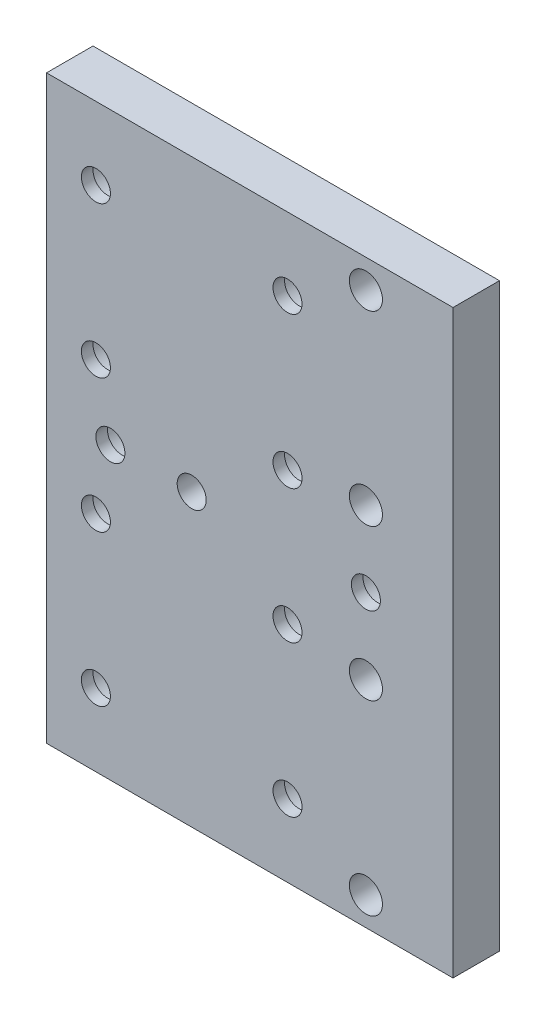
ISO-10303-21;
HEADER;
FILE_DESCRIPTION(('STEP AP214'),'2;1');
FILE_NAME('part.step','',(''),(''),'','','');
FILE_SCHEMA(('AUTOMOTIVE_DESIGN { 1 0 10303 214 1 1 1 1 }'));
ENDSEC;
DATA;
#1=APPLICATION_CONTEXT('core data for automotive mechanical design processes');
#2=APPLICATION_PROTOCOL_DEFINITION('international standard','automotive_design',2000,#1);
#3=PRODUCT_CONTEXT('',#1,'mechanical');
#4=PRODUCT('Part','Part','',(#3));
#5=PRODUCT_RELATED_PRODUCT_CATEGORY('part','',(#4));
#6=PRODUCT_DEFINITION_FORMATION('','',#4);
#7=PRODUCT_DEFINITION_CONTEXT('part definition',#1,'design');
#8=PRODUCT_DEFINITION('design','',#6,#7);
#9=PRODUCT_DEFINITION_SHAPE('','',#8);
#10=(LENGTH_UNIT() NAMED_UNIT(*) SI_UNIT(.MILLI.,.METRE.));
#11=(NAMED_UNIT(*) PLANE_ANGLE_UNIT() SI_UNIT($,.RADIAN.));
#12=(NAMED_UNIT(*) SI_UNIT($,.STERADIAN.) SOLID_ANGLE_UNIT());
#13=UNCERTAINTY_MEASURE_WITH_UNIT(LENGTH_MEASURE(1.E-05),#10,'distance_accuracy_value','');
#14=(GEOMETRIC_REPRESENTATION_CONTEXT(3) GLOBAL_UNCERTAINTY_ASSIGNED_CONTEXT((#13)) GLOBAL_UNIT_ASSIGNED_CONTEXT((#10,
#11,#12)) REPRESENTATION_CONTEXT('',''));
#15=CARTESIAN_POINT('',(0.,0.,0.));
#16=DIRECTION('',(0.,0.,1.));
#17=DIRECTION('',(1.,0.,0.));
#18=AXIS2_PLACEMENT_3D('',#15,#16,#17);
#19=CARTESIAN_POINT('',(-15.,0.,8.));
#20=DIRECTION('',(0.,0.,-1.));
#21=DIRECTION('',(-1.,0.,0.));
#22=AXIS2_PLACEMENT_3D('',#19,#20,#21);
#23=CYLINDRICAL_SURFACE('',#22,2.5);
#24=CARTESIAN_POINT('',(-15.,0.,8.));
#25=DIRECTION('',(0.,0.,-1.));
#26=DIRECTION('',(-1.,0.,0.));
#27=AXIS2_PLACEMENT_3D('',#24,#25,#26);
#28=CIRCLE('',#27,2.5);
#29=CARTESIAN_POINT('',(-17.5,0.,8.));
#30=VERTEX_POINT('',#29);
#31=EDGE_CURVE('E132',#30,#30,#28,.T.);
#32=ORIENTED_EDGE('',*,*,#31,.F.);
#33=EDGE_LOOP('',(#32));
#34=FACE_BOUND('',#33,.T.);
#35=CARTESIAN_POINT('',(-15.,0.,6.));
#36=DIRECTION('',(0.,0.,-1.));
#37=DIRECTION('',(-1.,0.,0.));
#38=AXIS2_PLACEMENT_3D('',#35,#36,#37);
#39=CIRCLE('',#38,2.5);
#40=CARTESIAN_POINT('',(-17.5,0.,6.));
#41=VERTEX_POINT('',#40);
#42=EDGE_CURVE('E38',#41,#41,#39,.F.);
#43=ORIENTED_EDGE('',*,*,#42,.F.);
#44=EDGE_LOOP('',(#43));
#45=FACE_BOUND('',#44,.T.);
#46=ADVANCED_FACE('F34',(#34,#45),#23,.F.);
#47=CARTESIAN_POINT('',(-59.,0.,8.));
#48=DIRECTION('',(0.,0.,-1.));
#49=DIRECTION('',(-1.,0.,0.));
#50=AXIS2_PLACEMENT_3D('',#47,#48,#49);
#51=CYLINDRICAL_SURFACE('',#50,2.5);
#52=CARTESIAN_POINT('',(-59.,0.,8.));
#53=DIRECTION('',(0.,0.,-1.));
#54=DIRECTION('',(-1.,0.,0.));
#55=AXIS2_PLACEMENT_3D('',#52,#53,#54);
#56=CIRCLE('',#55,2.5);
#57=CARTESIAN_POINT('',(-61.5,0.,8.));
#58=VERTEX_POINT('',#57);
#59=EDGE_CURVE('E93',#58,#58,#56,.T.);
#60=ORIENTED_EDGE('',*,*,#59,.F.);
#61=EDGE_LOOP('',(#60));
#62=FACE_BOUND('',#61,.T.);
#63=CARTESIAN_POINT('',(-59.,0.,6.));
#64=DIRECTION('',(0.,0.,-1.));
#65=DIRECTION('',(-1.,0.,0.));
#66=AXIS2_PLACEMENT_3D('',#63,#64,#65);
#67=CIRCLE('',#66,2.5);
#68=CARTESIAN_POINT('',(-61.5,0.,6.));
#69=VERTEX_POINT('',#68);
#70=EDGE_CURVE('E133',#69,#69,#67,.F.);
#71=ORIENTED_EDGE('',*,*,#70,.F.);
#72=EDGE_LOOP('',(#71));
#73=FACE_BOUND('',#72,.T.);
#74=ADVANCED_FACE('F281',(#62,#73),#51,.F.);
#75=CARTESIAN_POINT('',(-61.5,37.5,8.));
#76=DIRECTION('',(0.,0.,-1.));
#77=DIRECTION('',(-1.,0.,0.));
#78=AXIS2_PLACEMENT_3D('',#75,#76,#77);
#79=CYLINDRICAL_SURFACE('',#78,2.5);
#80=CARTESIAN_POINT('',(-61.5,37.5,8.));
#81=DIRECTION('',(0.,0.,1.));
#82=DIRECTION('',(1.,0.,0.));
#83=AXIS2_PLACEMENT_3D('',#80,#81,#82);
#84=CIRCLE('',#83,2.5);
#85=CARTESIAN_POINT('',(-59.,37.5,8.));
#86=VERTEX_POINT('',#85);
#87=EDGE_CURVE('E96',#86,#86,#84,.T.);
#88=ORIENTED_EDGE('',*,*,#87,.T.);
#89=EDGE_LOOP('',(#88));
#90=FACE_BOUND('',#89,.T.);
#91=CARTESIAN_POINT('',(-61.5,37.5,6.));
#92=DIRECTION('',(0.,0.,-1.));
#93=DIRECTION('',(-1.,0.,0.));
#94=AXIS2_PLACEMENT_3D('',#91,#92,#93);
#95=CIRCLE('',#94,2.5);
#96=CARTESIAN_POINT('',(-64.,37.5,6.));
#97=VERTEX_POINT('',#96);
#98=EDGE_CURVE('E130',#97,#97,#95,.T.);
#99=ORIENTED_EDGE('',*,*,#98,.T.);
#100=EDGE_LOOP('',(#99));
#101=FACE_BOUND('',#100,.T.);
#102=ADVANCED_FACE('F287',(#90,#101),#79,.F.);
#103=CARTESIAN_POINT('',(-28.5,37.5,8.));
#104=DIRECTION('',(0.,0.,-1.));
#105=DIRECTION('',(-1.,0.,0.));
#106=AXIS2_PLACEMENT_3D('',#103,#104,#105);
#107=CYLINDRICAL_SURFACE('',#106,2.5);
#108=CARTESIAN_POINT('',(-28.5,37.5,8.));
#109=DIRECTION('',(0.,0.,1.));
#110=DIRECTION('',(1.,0.,0.));
#111=AXIS2_PLACEMENT_3D('',#108,#109,#110);
#112=CIRCLE('',#111,2.5);
#113=CARTESIAN_POINT('',(-26.,37.5,8.));
#114=VERTEX_POINT('',#113);
#115=EDGE_CURVE('E101',#114,#114,#112,.T.);
#116=ORIENTED_EDGE('',*,*,#115,.T.);
#117=EDGE_LOOP('',(#116));
#118=FACE_BOUND('',#117,.T.);
#119=CARTESIAN_POINT('',(-28.5,37.5,6.));
#120=DIRECTION('',(0.,0.,-1.));
#121=DIRECTION('',(-1.,0.,0.));
#122=AXIS2_PLACEMENT_3D('',#119,#120,#121);
#123=CIRCLE('',#122,2.5);
#124=CARTESIAN_POINT('',(-31.,37.5,6.));
#125=VERTEX_POINT('',#124);
#126=EDGE_CURVE('E127',#125,#125,#123,.T.);
#127=ORIENTED_EDGE('',*,*,#126,.T.);
#128=EDGE_LOOP('',(#127));
#129=FACE_BOUND('',#128,.T.);
#130=ADVANCED_FACE('F487',(#118,#129),#107,.F.);
#131=CARTESIAN_POINT('',(-61.5,11.5,8.));
#132=DIRECTION('',(0.,0.,-1.));
#133=DIRECTION('',(-1.,0.,0.));
#134=AXIS2_PLACEMENT_3D('',#131,#132,#133);
#135=CYLINDRICAL_SURFACE('',#134,2.5);
#136=CARTESIAN_POINT('',(-61.5,11.5,8.));
#137=DIRECTION('',(0.,0.,1.));
#138=DIRECTION('',(1.,0.,0.));
#139=AXIS2_PLACEMENT_3D('',#136,#137,#138);
#140=CIRCLE('',#139,2.5);
#141=CARTESIAN_POINT('',(-59.,11.5,8.));
#142=VERTEX_POINT('',#141);
#143=EDGE_CURVE('E254',#142,#142,#140,.T.);
#144=ORIENTED_EDGE('',*,*,#143,.T.);
#145=EDGE_LOOP('',(#144));
#146=FACE_BOUND('',#145,.T.);
#147=CARTESIAN_POINT('',(-61.5,11.5,6.));
#148=DIRECTION('',(0.,0.,-1.));
#149=DIRECTION('',(-1.,0.,0.));
#150=AXIS2_PLACEMENT_3D('',#147,#148,#149);
#151=CIRCLE('',#150,2.5);
#152=CARTESIAN_POINT('',(-64.,11.5,6.));
#153=VERTEX_POINT('',#152);
#154=EDGE_CURVE('E124',#153,#153,#151,.T.);
#155=ORIENTED_EDGE('',*,*,#154,.T.);
#156=EDGE_LOOP('',(#155));
#157=FACE_BOUND('',#156,.T.);
#158=ADVANCED_FACE('F498',(#146,#157),#135,.F.);
#159=CARTESIAN_POINT('',(-28.5,11.5,8.));
#160=DIRECTION('',(0.,0.,-1.));
#161=DIRECTION('',(-1.,0.,0.));
#162=AXIS2_PLACEMENT_3D('',#159,#160,#161);
#163=CYLINDRICAL_SURFACE('',#162,2.5);
#164=CARTESIAN_POINT('',(-28.5,11.5,8.));
#165=DIRECTION('',(0.,0.,1.));
#166=DIRECTION('',(1.,0.,0.));
#167=AXIS2_PLACEMENT_3D('',#164,#165,#166);
#168=CIRCLE('',#167,2.5);
#169=CARTESIAN_POINT('',(-26.,11.5,8.));
#170=VERTEX_POINT('',#169);
#171=EDGE_CURVE('E251',#170,#170,#168,.T.);
#172=ORIENTED_EDGE('',*,*,#171,.T.);
#173=EDGE_LOOP('',(#172));
#174=FACE_BOUND('',#173,.T.);
#175=CARTESIAN_POINT('',(-28.5,11.5,6.));
#176=DIRECTION('',(0.,0.,-1.));
#177=DIRECTION('',(-1.,0.,0.));
#178=AXIS2_PLACEMENT_3D('',#175,#176,#177);
#179=CIRCLE('',#178,2.5);
#180=CARTESIAN_POINT('',(-31.,11.5,6.));
#181=VERTEX_POINT('',#180);
#182=EDGE_CURVE('E121',#181,#181,#179,.T.);
#183=ORIENTED_EDGE('',*,*,#182,.T.);
#184=EDGE_LOOP('',(#183));
#185=FACE_BOUND('',#184,.T.);
#186=ADVANCED_FACE('F508',(#174,#185),#163,.F.);
#187=CARTESIAN_POINT('',(-61.5,-11.5,8.));
#188=DIRECTION('',(0.,0.,-1.));
#189=DIRECTION('',(-1.,0.,0.));
#190=AXIS2_PLACEMENT_3D('',#187,#188,#189);
#191=CYLINDRICAL_SURFACE('',#190,2.5);
#192=CARTESIAN_POINT('',(-61.5,-11.5,8.));
#193=DIRECTION('',(0.,0.,1.));
#194=DIRECTION('',(1.,0.,0.));
#195=AXIS2_PLACEMENT_3D('',#192,#193,#194);
#196=CIRCLE('',#195,2.5);
#197=CARTESIAN_POINT('',(-59.,-11.5,8.));
#198=VERTEX_POINT('',#197);
#199=EDGE_CURVE('E248',#198,#198,#196,.T.);
#200=ORIENTED_EDGE('',*,*,#199,.T.);
#201=EDGE_LOOP('',(#200));
#202=FACE_BOUND('',#201,.T.);
#203=CARTESIAN_POINT('',(-61.5,-11.5,6.));
#204=DIRECTION('',(0.,0.,-1.));
#205=DIRECTION('',(-1.,0.,0.));
#206=AXIS2_PLACEMENT_3D('',#203,#204,#205);
#207=CIRCLE('',#206,2.5);
#208=CARTESIAN_POINT('',(-64.,-11.5,6.));
#209=VERTEX_POINT('',#208);
#210=EDGE_CURVE('E118',#209,#209,#207,.T.);
#211=ORIENTED_EDGE('',*,*,#210,.T.);
#212=EDGE_LOOP('',(#211));
#213=FACE_BOUND('',#212,.T.);
#214=ADVANCED_FACE('F518',(#202,#213),#191,.F.);
#215=CARTESIAN_POINT('',(-28.5,-11.5,8.));
#216=DIRECTION('',(0.,0.,-1.));
#217=DIRECTION('',(-1.,0.,0.));
#218=AXIS2_PLACEMENT_3D('',#215,#216,#217);
#219=CYLINDRICAL_SURFACE('',#218,2.5);
#220=CARTESIAN_POINT('',(-28.5,-11.5,8.));
#221=DIRECTION('',(0.,0.,1.));
#222=DIRECTION('',(1.,0.,0.));
#223=AXIS2_PLACEMENT_3D('',#220,#221,#222);
#224=CIRCLE('',#223,2.5);
#225=CARTESIAN_POINT('',(-26.,-11.5,8.));
#226=VERTEX_POINT('',#225);
#227=EDGE_CURVE('E245',#226,#226,#224,.T.);
#228=ORIENTED_EDGE('',*,*,#227,.T.);
#229=EDGE_LOOP('',(#228));
#230=FACE_BOUND('',#229,.T.);
#231=CARTESIAN_POINT('',(-28.5,-11.5,6.));
#232=DIRECTION('',(0.,0.,-1.));
#233=DIRECTION('',(-1.,0.,0.));
#234=AXIS2_PLACEMENT_3D('',#231,#232,#233);
#235=CIRCLE('',#234,2.5);
#236=CARTESIAN_POINT('',(-31.,-11.5,6.));
#237=VERTEX_POINT('',#236);
#238=EDGE_CURVE('E115',#237,#237,#235,.T.);
#239=ORIENTED_EDGE('',*,*,#238,.T.);
#240=EDGE_LOOP('',(#239));
#241=FACE_BOUND('',#240,.T.);
#242=ADVANCED_FACE('F528',(#230,#241),#219,.F.);
#243=CARTESIAN_POINT('',(-28.5,-37.5,8.));
#244=DIRECTION('',(0.,0.,-1.));
#245=DIRECTION('',(-1.,0.,0.));
#246=AXIS2_PLACEMENT_3D('',#243,#244,#245);
#247=CYLINDRICAL_SURFACE('',#246,2.5);
#248=CARTESIAN_POINT('',(-28.5,-37.5,8.));
#249=DIRECTION('',(0.,0.,1.));
#250=DIRECTION('',(1.,0.,0.));
#251=AXIS2_PLACEMENT_3D('',#248,#249,#250);
#252=CIRCLE('',#251,2.5);
#253=CARTESIAN_POINT('',(-26.,-37.5,8.));
#254=VERTEX_POINT('',#253);
#255=EDGE_CURVE('E242',#254,#254,#252,.T.);
#256=ORIENTED_EDGE('',*,*,#255,.T.);
#257=EDGE_LOOP('',(#256));
#258=FACE_BOUND('',#257,.T.);
#259=CARTESIAN_POINT('',(-28.5,-37.5,6.));
#260=DIRECTION('',(0.,0.,-1.));
#261=DIRECTION('',(-1.,0.,0.));
#262=AXIS2_PLACEMENT_3D('',#259,#260,#261);
#263=CIRCLE('',#262,2.5);
#264=CARTESIAN_POINT('',(-31.,-37.5,6.));
#265=VERTEX_POINT('',#264);
#266=EDGE_CURVE('E111',#265,#265,#263,.T.);
#267=ORIENTED_EDGE('',*,*,#266,.T.);
#268=EDGE_LOOP('',(#267));
#269=FACE_BOUND('',#268,.T.);
#270=ADVANCED_FACE('F538',(#258,#269),#247,.F.);
#271=CARTESIAN_POINT('',(-61.5,-37.5,8.));
#272=DIRECTION('',(0.,0.,-1.));
#273=DIRECTION('',(-1.,0.,0.));
#274=AXIS2_PLACEMENT_3D('',#271,#272,#273);
#275=CYLINDRICAL_SURFACE('',#274,2.5);
#276=CARTESIAN_POINT('',(-61.5,-37.5,8.));
#277=DIRECTION('',(0.,0.,1.));
#278=DIRECTION('',(1.,0.,0.));
#279=AXIS2_PLACEMENT_3D('',#276,#277,#278);
#280=CIRCLE('',#279,2.5);
#281=CARTESIAN_POINT('',(-59.,-37.5,8.));
#282=VERTEX_POINT('',#281);
#283=EDGE_CURVE('E237',#282,#282,#280,.T.);
#284=ORIENTED_EDGE('',*,*,#283,.T.);
#285=EDGE_LOOP('',(#284));
#286=FACE_BOUND('',#285,.T.);
#287=CARTESIAN_POINT('',(-61.5,-37.5,6.));
#288=DIRECTION('',(0.,0.,-1.));
#289=DIRECTION('',(-1.,0.,0.));
#290=AXIS2_PLACEMENT_3D('',#287,#288,#289);
#291=CIRCLE('',#290,2.5);
#292=CARTESIAN_POINT('',(-64.,-37.5,6.));
#293=VERTEX_POINT('',#292);
#294=EDGE_CURVE('E108',#293,#293,#291,.T.);
#295=ORIENTED_EDGE('',*,*,#294,.T.);
#296=EDGE_LOOP('',(#295));
#297=FACE_BOUND('',#296,.T.);
#298=ADVANCED_FACE('F548',(#286,#297),#275,.F.);
#299=CARTESIAN_POINT('',(0.,0.,8.));
#300=DIRECTION('',(0.,0.,1.));
#301=DIRECTION('',(1.,0.,0.));
#302=AXIS2_PLACEMENT_3D('',#299,#300,#301);
#303=PLANE('',#302);
#304=ORIENTED_EDGE('',*,*,#59,.T.);
#305=EDGE_LOOP('',(#304));
#306=FACE_BOUND('',#305,.T.);
#307=ORIENTED_EDGE('',*,*,#31,.T.);
#308=EDGE_LOOP('',(#307));
#309=FACE_BOUND('',#308,.T.);
#310=DIRECTION('',(-1.,0.,0.));
#311=VECTOR('',#310,1.);
#312=CARTESIAN_POINT('',(19.5289531826023,50.,8.));
#313=LINE('',#312,#311);
#314=CARTESIAN_POINT('',(0.,50.,8.));
#315=VERTEX_POINT('',#314);
#316=CARTESIAN_POINT('',(-70.,50.,8.));
#317=VERTEX_POINT('',#316);
#318=EDGE_CURVE('E51',#315,#317,#313,.T.);
#319=ORIENTED_EDGE('',*,*,#318,.T.);
#320=DIRECTION('',(0.,-1.,0.));
#321=VECTOR('',#320,1.);
#322=CARTESIAN_POINT('',(-70.,60.,8.));
#323=LINE('',#322,#321);
#324=CARTESIAN_POINT('',(-70.,-50.,8.));
#325=VERTEX_POINT('',#324);
#326=EDGE_CURVE('E98',#317,#325,#323,.T.);
#327=ORIENTED_EDGE('',*,*,#326,.T.);
#328=DIRECTION('',(1.,0.,0.));
#329=VECTOR('',#328,1.);
#330=CARTESIAN_POINT('',(25.5248272211387,-50.,8.));
#331=LINE('',#330,#329);
#332=CARTESIAN_POINT('',(0.,-50.,8.));
#333=VERTEX_POINT('',#332);
#334=EDGE_CURVE('E77',#325,#333,#331,.T.);
#335=ORIENTED_EDGE('',*,*,#334,.T.);
#336=DIRECTION('',(0.,1.,0.));
#337=VECTOR('',#336,1.);
#338=CARTESIAN_POINT('',(0.,-60.,8.));
#339=LINE('',#338,#337);
#340=EDGE_CURVE('E104',#333,#315,#339,.T.);
#341=ORIENTED_EDGE('',*,*,#340,.T.);
#342=EDGE_LOOP('',(#319,#327,#335,#341));
#343=FACE_BOUND('',#342,.T.);
#344=CARTESIAN_POINT('',(-45.,0.,8.));
#345=DIRECTION('',(0.,0.,1.));
#346=DIRECTION('',(1.,0.,0.));
#347=AXIS2_PLACEMENT_3D('',#344,#345,#346);
#348=CIRCLE('',#347,2.5);
#349=CARTESIAN_POINT('',(-42.5,0.,8.));
#350=VERTEX_POINT('',#349);
#351=EDGE_CURVE('E209',#350,#350,#348,.T.);
#352=ORIENTED_EDGE('',*,*,#351,.F.);
#353=EDGE_LOOP('',(#352));
#354=FACE_BOUND('',#353,.T.);
#355=CARTESIAN_POINT('',(-15.,-13.,8.));
#356=DIRECTION('',(0.,0.,1.));
#357=DIRECTION('',(1.,0.,0.));
#358=AXIS2_PLACEMENT_3D('',#355,#356,#357);
#359=CIRCLE('',#358,2.85);
#360=CARTESIAN_POINT('',(-12.15,-13.,8.));
#361=VERTEX_POINT('',#360);
#362=EDGE_CURVE('E222',#361,#361,#359,.T.);
#363=ORIENTED_EDGE('',*,*,#362,.F.);
#364=EDGE_LOOP('',(#363));
#365=FACE_BOUND('',#364,.T.);
#366=CARTESIAN_POINT('',(-15.,45.1,8.));
#367=DIRECTION('',(0.,0.,1.));
#368=DIRECTION('',(1.,0.,0.));
#369=AXIS2_PLACEMENT_3D('',#366,#367,#368);
#370=CIRCLE('',#369,2.85);
#371=CARTESIAN_POINT('',(-12.15,45.1,8.));
#372=VERTEX_POINT('',#371);
#373=EDGE_CURVE('E234',#372,#372,#370,.T.);
#374=ORIENTED_EDGE('',*,*,#373,.F.);
#375=EDGE_LOOP('',(#374));
#376=FACE_BOUND('',#375,.T.);
#377=ORIENTED_EDGE('',*,*,#255,.F.);
#378=EDGE_LOOP('',(#377));
#379=FACE_BOUND('',#378,.T.);
#380=ORIENTED_EDGE('',*,*,#199,.F.);
#381=EDGE_LOOP('',(#380));
#382=FACE_BOUND('',#381,.T.);
#383=ORIENTED_EDGE('',*,*,#143,.F.);
#384=EDGE_LOOP('',(#383));
#385=FACE_BOUND('',#384,.T.);
#386=ORIENTED_EDGE('',*,*,#87,.F.);
#387=EDGE_LOOP('',(#386));
#388=FACE_BOUND('',#387,.T.);
#389=ORIENTED_EDGE('',*,*,#115,.F.);
#390=EDGE_LOOP('',(#389));
#391=FACE_BOUND('',#390,.T.);
#392=ORIENTED_EDGE('',*,*,#171,.F.);
#393=EDGE_LOOP('',(#392));
#394=FACE_BOUND('',#393,.T.);
#395=ORIENTED_EDGE('',*,*,#227,.F.);
#396=EDGE_LOOP('',(#395));
#397=FACE_BOUND('',#396,.T.);
#398=ORIENTED_EDGE('',*,*,#283,.F.);
#399=EDGE_LOOP('',(#398));
#400=FACE_BOUND('',#399,.T.);
#401=CARTESIAN_POINT('',(-15.,13.,8.));
#402=DIRECTION('',(0.,0.,1.));
#403=DIRECTION('',(1.,0.,0.));
#404=AXIS2_PLACEMENT_3D('',#401,#402,#403);
#405=CIRCLE('',#404,2.85);
#406=CARTESIAN_POINT('',(-12.15,13.,8.));
#407=VERTEX_POINT('',#406);
#408=EDGE_CURVE('E228',#407,#407,#405,.T.);
#409=ORIENTED_EDGE('',*,*,#408,.F.);
#410=EDGE_LOOP('',(#409));
#411=FACE_BOUND('',#410,.T.);
#412=CARTESIAN_POINT('',(-15.,-45.1,8.));
#413=DIRECTION('',(0.,0.,1.));
#414=DIRECTION('',(1.,0.,0.));
#415=AXIS2_PLACEMENT_3D('',#412,#413,#414);
#416=CIRCLE('',#415,2.85);
#417=CARTESIAN_POINT('',(-12.15,-45.1,8.));
#418=VERTEX_POINT('',#417);
#419=EDGE_CURVE('E216',#418,#418,#416,.T.);
#420=ORIENTED_EDGE('',*,*,#419,.F.);
#421=EDGE_LOOP('',(#420));
#422=FACE_BOUND('',#421,.T.);
#423=ADVANCED_FACE('F261',(#306,#309,#343,#354,#365,#376,#379,#382,#385,#388,#391,#394,#397,
#400,#411,#422),#303,.T.);
#424=CARTESIAN_POINT('',(0.,0.,0.));
#425=DIRECTION('',(0.,0.,1.));
#426=DIRECTION('',(1.,0.,0.));
#427=AXIS2_PLACEMENT_3D('',#424,#425,#426);
#428=PLANE('',#427);
#429=CARTESIAN_POINT('',(-15.,0.,0.));
#430=DIRECTION('',(0.,0.,-1.));
#431=DIRECTION('',(-1.,0.,0.));
#432=AXIS2_PLACEMENT_3D('',#429,#430,#431);
#433=CIRCLE('',#432,4.25);
#434=CARTESIAN_POINT('',(-19.25,0.,0.));
#435=VERTEX_POINT('',#434);
#436=EDGE_CURVE('E141',#435,#435,#433,.T.);
#437=ORIENTED_EDGE('',*,*,#436,.F.);
#438=EDGE_LOOP('',(#437));
#439=FACE_BOUND('',#438,.T.);
#440=CARTESIAN_POINT('',(-59.,0.,0.));
#441=DIRECTION('',(0.,0.,-1.));
#442=DIRECTION('',(-1.,0.,0.));
#443=AXIS2_PLACEMENT_3D('',#440,#441,#442);
#444=CIRCLE('',#443,4.25000000000001);
#445=CARTESIAN_POINT('',(-63.25,0.,0.));
#446=VERTEX_POINT('',#445);
#447=EDGE_CURVE('E151',#446,#446,#444,.T.);
#448=ORIENTED_EDGE('',*,*,#447,.F.);
#449=EDGE_LOOP('',(#448));
#450=FACE_BOUND('',#449,.T.);
#451=CARTESIAN_POINT('',(-28.5,-11.5,0.));
#452=DIRECTION('',(0.,0.,-1.));
#453=DIRECTION('',(-1.,0.,0.));
#454=AXIS2_PLACEMENT_3D('',#451,#452,#453);
#455=CIRCLE('',#454,4.25);
#456=CARTESIAN_POINT('',(-32.75,-11.5,0.));
#457=VERTEX_POINT('',#456);
#458=EDGE_CURVE('E157',#457,#457,#455,.T.);
#459=ORIENTED_EDGE('',*,*,#458,.F.);
#460=EDGE_LOOP('',(#459));
#461=FACE_BOUND('',#460,.T.);
#462=CARTESIAN_POINT('',(-61.5,11.5,0.));
#463=DIRECTION('',(0.,0.,-1.));
#464=DIRECTION('',(-1.,0.,0.));
#465=AXIS2_PLACEMENT_3D('',#462,#463,#464);
#466=CIRCLE('',#465,4.25);
#467=CARTESIAN_POINT('',(-65.75,11.5,0.));
#468=VERTEX_POINT('',#467);
#469=EDGE_CURVE('E176',#468,#468,#466,.T.);
#470=ORIENTED_EDGE('',*,*,#469,.F.);
#471=EDGE_LOOP('',(#470));
#472=FACE_BOUND('',#471,.T.);
#473=CARTESIAN_POINT('',(-28.5,11.5,0.));
#474=DIRECTION('',(0.,0.,-1.));
#475=DIRECTION('',(-1.,0.,0.));
#476=AXIS2_PLACEMENT_3D('',#473,#474,#475);
#477=CIRCLE('',#476,4.25);
#478=CARTESIAN_POINT('',(-32.75,11.5,0.));
#479=VERTEX_POINT('',#478);
#480=EDGE_CURVE('E175',#479,#479,#477,.T.);
#481=ORIENTED_EDGE('',*,*,#480,.F.);
#482=EDGE_LOOP('',(#481));
#483=FACE_BOUND('',#482,.T.);
#484=CARTESIAN_POINT('',(-61.5,37.5,0.));
#485=DIRECTION('',(0.,0.,-1.));
#486=DIRECTION('',(-1.,0.,0.));
#487=AXIS2_PLACEMENT_3D('',#484,#485,#486);
#488=CIRCLE('',#487,4.25);
#489=CARTESIAN_POINT('',(-65.75,37.5,0.));
#490=VERTEX_POINT('',#489);
#491=EDGE_CURVE('E188',#490,#490,#488,.T.);
#492=ORIENTED_EDGE('',*,*,#491,.F.);
#493=EDGE_LOOP('',(#492));
#494=FACE_BOUND('',#493,.T.);
#495=CARTESIAN_POINT('',(-61.5,-11.5,0.));
#496=DIRECTION('',(0.,0.,-1.));
#497=DIRECTION('',(-1.,0.,0.));
#498=AXIS2_PLACEMENT_3D('',#495,#496,#497);
#499=CIRCLE('',#498,4.25);
#500=CARTESIAN_POINT('',(-65.75,-11.5,0.));
#501=VERTEX_POINT('',#500);
#502=EDGE_CURVE('E158',#501,#501,#499,.T.);
#503=ORIENTED_EDGE('',*,*,#502,.F.);
#504=EDGE_LOOP('',(#503));
#505=FACE_BOUND('',#504,.T.);
#506=CARTESIAN_POINT('',(-61.5,-37.5,0.));
#507=DIRECTION('',(0.,0.,-1.));
#508=DIRECTION('',(-1.,0.,0.));
#509=AXIS2_PLACEMENT_3D('',#506,#507,#508);
#510=CIRCLE('',#509,4.25);
#511=CARTESIAN_POINT('',(-65.75,-37.5,0.));
#512=VERTEX_POINT('',#511);
#513=EDGE_CURVE('E164',#512,#512,#510,.T.);
#514=ORIENTED_EDGE('',*,*,#513,.F.);
#515=EDGE_LOOP('',(#514));
#516=FACE_BOUND('',#515,.T.);
#517=CARTESIAN_POINT('',(-28.5,-37.5,0.));
#518=DIRECTION('',(0.,0.,-1.));
#519=DIRECTION('',(-1.,0.,0.));
#520=AXIS2_PLACEMENT_3D('',#517,#518,#519);
#521=CIRCLE('',#520,4.25000000000001);
#522=CARTESIAN_POINT('',(-32.75,-37.5,0.));
#523=VERTEX_POINT('',#522);
#524=EDGE_CURVE('E139',#523,#523,#521,.T.);
#525=ORIENTED_EDGE('',*,*,#524,.F.);
#526=EDGE_LOOP('',(#525));
#527=FACE_BOUND('',#526,.T.);
#528=CARTESIAN_POINT('',(-28.5,37.5,0.));
#529=DIRECTION('',(0.,0.,-1.));
#530=DIRECTION('',(-1.,0.,0.));
#531=AXIS2_PLACEMENT_3D('',#528,#529,#530);
#532=CIRCLE('',#531,4.25);
#533=CARTESIAN_POINT('',(-32.75,37.5,0.));
#534=VERTEX_POINT('',#533);
#535=EDGE_CURVE('E187',#534,#534,#532,.T.);
#536=ORIENTED_EDGE('',*,*,#535,.F.);
#537=EDGE_LOOP('',(#536));
#538=FACE_BOUND('',#537,.T.);
#539=CARTESIAN_POINT('',(-45.,0.,0.));
#540=DIRECTION('',(0.,0.,1.));
#541=DIRECTION('',(1.,0.,0.));
#542=AXIS2_PLACEMENT_3D('',#539,#540,#541);
#543=CIRCLE('',#542,2.5);
#544=CARTESIAN_POINT('',(-42.5,0.,0.));
#545=VERTEX_POINT('',#544);
#546=EDGE_CURVE('E210',#545,#545,#543,.T.);
#547=ORIENTED_EDGE('',*,*,#546,.T.);
#548=EDGE_LOOP('',(#547));
#549=FACE_BOUND('',#548,.T.);
#550=DIRECTION('',(0.,-1.,0.));
#551=VECTOR('',#550,1.);
#552=CARTESIAN_POINT('',(-70.,60.,0.));
#553=LINE('',#552,#551);
#554=CARTESIAN_POINT('',(-70.,50.,0.));
#555=VERTEX_POINT('',#554);
#556=CARTESIAN_POINT('',(-70.,-50.,0.));
#557=VERTEX_POINT('',#556);
#558=EDGE_CURVE('E90',#555,#557,#553,.T.);
#559=ORIENTED_EDGE('',*,*,#558,.F.);
#560=DIRECTION('',(-1.,0.,0.));
#561=VECTOR('',#560,1.);
#562=CARTESIAN_POINT('',(19.5289531826023,50.,0.));
#563=LINE('',#562,#561);
#564=CARTESIAN_POINT('',(0.,50.,0.));
#565=VERTEX_POINT('',#564);
#566=EDGE_CURVE('E205',#565,#555,#563,.T.);
#567=ORIENTED_EDGE('',*,*,#566,.F.);
#568=DIRECTION('',(0.,1.,0.));
#569=VECTOR('',#568,1.);
#570=CARTESIAN_POINT('',(0.,-60.,0.));
#571=LINE('',#570,#569);
#572=CARTESIAN_POINT('',(0.,-50.,0.));
#573=VERTEX_POINT('',#572);
#574=EDGE_CURVE('E92',#573,#565,#571,.T.);
#575=ORIENTED_EDGE('',*,*,#574,.F.);
#576=DIRECTION('',(1.,0.,0.));
#577=VECTOR('',#576,1.);
#578=CARTESIAN_POINT('',(25.5248272211387,-50.,0.));
#579=LINE('',#578,#577);
#580=EDGE_CURVE('E58',#557,#573,#579,.T.);
#581=ORIENTED_EDGE('',*,*,#580,.F.);
#582=EDGE_LOOP('',(#559,#567,#575,#581));
#583=FACE_BOUND('',#582,.T.);
#584=CARTESIAN_POINT('',(-15.,45.1,0.));
#585=DIRECTION('',(0.,0.,1.));
#586=DIRECTION('',(1.,0.,0.));
#587=AXIS2_PLACEMENT_3D('',#584,#585,#586);
#588=CIRCLE('',#587,2.85);
#589=CARTESIAN_POINT('',(-12.15,45.1,0.));
#590=VERTEX_POINT('',#589);
#591=EDGE_CURVE('E231',#590,#590,#588,.T.);
#592=ORIENTED_EDGE('',*,*,#591,.T.);
#593=EDGE_LOOP('',(#592));
#594=FACE_BOUND('',#593,.T.);
#595=CARTESIAN_POINT('',(-15.,13.,0.));
#596=DIRECTION('',(0.,0.,1.));
#597=DIRECTION('',(1.,0.,0.));
#598=AXIS2_PLACEMENT_3D('',#595,#596,#597);
#599=CIRCLE('',#598,2.85);
#600=CARTESIAN_POINT('',(-12.15,13.,0.));
#601=VERTEX_POINT('',#600);
#602=EDGE_CURVE('E225',#601,#601,#599,.T.);
#603=ORIENTED_EDGE('',*,*,#602,.T.);
#604=EDGE_LOOP('',(#603));
#605=FACE_BOUND('',#604,.T.);
#606=CARTESIAN_POINT('',(-15.,-13.,0.));
#607=DIRECTION('',(0.,0.,1.));
#608=DIRECTION('',(1.,0.,0.));
#609=AXIS2_PLACEMENT_3D('',#606,#607,#608);
#610=CIRCLE('',#609,2.85);
#611=CARTESIAN_POINT('',(-12.15,-13.,0.));
#612=VERTEX_POINT('',#611);
#613=EDGE_CURVE('E219',#612,#612,#610,.T.);
#614=ORIENTED_EDGE('',*,*,#613,.T.);
#615=EDGE_LOOP('',(#614));
#616=FACE_BOUND('',#615,.T.);
#617=CARTESIAN_POINT('',(-15.,-45.1,0.));
#618=DIRECTION('',(0.,0.,1.));
#619=DIRECTION('',(1.,0.,0.));
#620=AXIS2_PLACEMENT_3D('',#617,#618,#619);
#621=CIRCLE('',#620,2.85);
#622=CARTESIAN_POINT('',(-12.15,-45.1,0.));
#623=VERTEX_POINT('',#622);
#624=EDGE_CURVE('E213',#623,#623,#621,.T.);
#625=ORIENTED_EDGE('',*,*,#624,.T.);
#626=EDGE_LOOP('',(#625));
#627=FACE_BOUND('',#626,.T.);
#628=ADVANCED_FACE('F87',(#439,#450,#461,#472,#483,#494,#505,#516,#527,#538,#549,#583,#594,#605,
#616,#627),#428,.F.);
#629=CARTESIAN_POINT('',(-70.,60.,8.));
#630=DIRECTION('',(1.,0.,0.));
#631=DIRECTION('',(0.,0.,-1.));
#632=AXIS2_PLACEMENT_3D('',#629,#630,#631);
#633=PLANE('',#632);
#634=ORIENTED_EDGE('',*,*,#326,.F.);
#635=DIRECTION('',(0.,0.,-1.));
#636=VECTOR('',#635,1.);
#637=CARTESIAN_POINT('',(-70.,50.,8.));
#638=LINE('',#637,#636);
#639=EDGE_CURVE('E82',#317,#555,#638,.T.);
#640=ORIENTED_EDGE('',*,*,#639,.T.);
#641=ORIENTED_EDGE('',*,*,#558,.T.);
#642=DIRECTION('',(0.,0.,1.));
#643=VECTOR('',#642,1.);
#644=CARTESIAN_POINT('',(-70.,-50.,8.));
#645=LINE('',#644,#643);
#646=EDGE_CURVE('E74',#557,#325,#645,.T.);
#647=ORIENTED_EDGE('',*,*,#646,.T.);
#648=EDGE_LOOP('',(#634,#640,#641,#647));
#649=FACE_BOUND('',#648,.T.);
#650=ADVANCED_FACE('F36',(#649),#633,.F.);
#651=CARTESIAN_POINT('',(0.,-60.,8.));
#652=DIRECTION('',(-1.,0.,0.));
#653=DIRECTION('',(0.,0.,1.));
#654=AXIS2_PLACEMENT_3D('',#651,#652,#653);
#655=PLANE('',#654);
#656=ORIENTED_EDGE('',*,*,#574,.T.);
#657=DIRECTION('',(0.,0.,1.));
#658=VECTOR('',#657,1.);
#659=CARTESIAN_POINT('',(0.,50.,8.));
#660=LINE('',#659,#658);
#661=EDGE_CURVE('E11',#565,#315,#660,.T.);
#662=ORIENTED_EDGE('',*,*,#661,.T.);
#663=ORIENTED_EDGE('',*,*,#340,.F.);
#664=DIRECTION('',(0.,0.,-1.));
#665=VECTOR('',#664,1.);
#666=CARTESIAN_POINT('',(0.,-50.,8.));
#667=LINE('',#666,#665);
#668=EDGE_CURVE('E43',#333,#573,#667,.T.);
#669=ORIENTED_EDGE('',*,*,#668,.T.);
#670=EDGE_LOOP('',(#656,#662,#663,#669));
#671=FACE_BOUND('',#670,.T.);
#672=ADVANCED_FACE('F264',(#671),#655,.F.);
#673=CARTESIAN_POINT('',(-15.,45.1,8.));
#674=DIRECTION('',(0.,0.,-1.));
#675=DIRECTION('',(-1.,0.,0.));
#676=AXIS2_PLACEMENT_3D('',#673,#674,#675);
#677=CYLINDRICAL_SURFACE('',#676,2.85);
#678=ORIENTED_EDGE('',*,*,#373,.T.);
#679=EDGE_LOOP('',(#678));
#680=FACE_BOUND('',#679,.T.);
#681=ORIENTED_EDGE('',*,*,#591,.F.);
#682=EDGE_LOOP('',(#681));
#683=FACE_BOUND('',#682,.T.);
#684=ADVANCED_FACE('F603',(#680,#683),#677,.F.);
#685=CARTESIAN_POINT('',(-15.,13.,8.));
#686=DIRECTION('',(0.,0.,-1.));
#687=DIRECTION('',(-1.,0.,0.));
#688=AXIS2_PLACEMENT_3D('',#685,#686,#687);
#689=CYLINDRICAL_SURFACE('',#688,2.85);
#690=ORIENTED_EDGE('',*,*,#408,.T.);
#691=EDGE_LOOP('',(#690));
#692=FACE_BOUND('',#691,.T.);
#693=ORIENTED_EDGE('',*,*,#602,.F.);
#694=EDGE_LOOP('',(#693));
#695=FACE_BOUND('',#694,.T.);
#696=ADVANCED_FACE('F594',(#692,#695),#689,.F.);
#697=CARTESIAN_POINT('',(-15.,-13.,8.));
#698=DIRECTION('',(0.,0.,-1.));
#699=DIRECTION('',(-1.,0.,0.));
#700=AXIS2_PLACEMENT_3D('',#697,#698,#699);
#701=CYLINDRICAL_SURFACE('',#700,2.85);
#702=ORIENTED_EDGE('',*,*,#362,.T.);
#703=EDGE_LOOP('',(#702));
#704=FACE_BOUND('',#703,.T.);
#705=ORIENTED_EDGE('',*,*,#613,.F.);
#706=EDGE_LOOP('',(#705));
#707=FACE_BOUND('',#706,.T.);
#708=ADVANCED_FACE('F585',(#704,#707),#701,.F.);
#709=CARTESIAN_POINT('',(-15.,-45.1,8.));
#710=DIRECTION('',(0.,0.,-1.));
#711=DIRECTION('',(-1.,0.,0.));
#712=AXIS2_PLACEMENT_3D('',#709,#710,#711);
#713=CYLINDRICAL_SURFACE('',#712,2.85);
#714=ORIENTED_EDGE('',*,*,#419,.T.);
#715=EDGE_LOOP('',(#714));
#716=FACE_BOUND('',#715,.T.);
#717=ORIENTED_EDGE('',*,*,#624,.F.);
#718=EDGE_LOOP('',(#717));
#719=FACE_BOUND('',#718,.T.);
#720=ADVANCED_FACE('F575',(#716,#719),#713,.F.);
#721=CARTESIAN_POINT('',(-45.,0.,0.));
#722=DIRECTION('',(0.,0.,1.));
#723=DIRECTION('',(1.,0.,0.));
#724=AXIS2_PLACEMENT_3D('',#721,#722,#723);
#725=CYLINDRICAL_SURFACE('',#724,2.5);
#726=ORIENTED_EDGE('',*,*,#546,.F.);
#727=EDGE_LOOP('',(#726));
#728=FACE_BOUND('',#727,.T.);
#729=ORIENTED_EDGE('',*,*,#351,.T.);
#730=EDGE_LOOP('',(#729));
#731=FACE_BOUND('',#730,.T.);
#732=ADVANCED_FACE('F277',(#728,#731),#725,.F.);
#733=CARTESIAN_POINT('',(25.5248272211387,-50.,8.));
#734=DIRECTION('',(0.,1.,0.));
#735=DIRECTION('',(0.,0.,1.));
#736=AXIS2_PLACEMENT_3D('',#733,#734,#735);
#737=PLANE('',#736);
#738=ORIENTED_EDGE('',*,*,#580,.T.);
#739=ORIENTED_EDGE('',*,*,#668,.F.);
#740=ORIENTED_EDGE('',*,*,#334,.F.);
#741=ORIENTED_EDGE('',*,*,#646,.F.);
#742=EDGE_LOOP('',(#738,#739,#740,#741));
#743=FACE_BOUND('',#742,.T.);
#744=ADVANCED_FACE('F75',(#743),#737,.F.);
#745=CARTESIAN_POINT('',(19.5289531826023,50.,8.));
#746=DIRECTION('',(0.,-1.,0.));
#747=DIRECTION('',(0.,0.,-1.));
#748=AXIS2_PLACEMENT_3D('',#745,#746,#747);
#749=PLANE('',#748);
#750=ORIENTED_EDGE('',*,*,#318,.F.);
#751=ORIENTED_EDGE('',*,*,#661,.F.);
#752=ORIENTED_EDGE('',*,*,#566,.T.);
#753=ORIENTED_EDGE('',*,*,#639,.F.);
#754=EDGE_LOOP('',(#750,#751,#752,#753));
#755=FACE_BOUND('',#754,.T.);
#756=ADVANCED_FACE('F265',(#755),#749,.F.);
#757=CARTESIAN_POINT('',(-61.5,-37.5,6.));
#758=DIRECTION('',(0.,0.,-1.));
#759=DIRECTION('',(-1.,0.,0.));
#760=AXIS2_PLACEMENT_3D('',#757,#758,#759);
#761=CYLINDRICAL_SURFACE('',#760,4.25);
#762=CARTESIAN_POINT('',(-61.5,-37.5,6.));
#763=DIRECTION('',(0.,0.,-1.));
#764=DIRECTION('',(-1.,0.,0.));
#765=AXIS2_PLACEMENT_3D('',#762,#763,#764);
#766=CIRCLE('',#765,4.25);
#767=CARTESIAN_POINT('',(-65.75,-37.5,6.));
#768=VERTEX_POINT('',#767);
#769=EDGE_CURVE('E161',#768,#768,#766,.T.);
#770=ORIENTED_EDGE('',*,*,#769,.F.);
#771=EDGE_LOOP('',(#770));
#772=FACE_BOUND('',#771,.T.);
#773=ORIENTED_EDGE('',*,*,#513,.T.);
#774=EDGE_LOOP('',(#773));
#775=FACE_BOUND('',#774,.T.);
#776=ADVANCED_FACE('F267',(#772,#775),#761,.F.);
#777=CARTESIAN_POINT('',(-61.5,-37.5,6.));
#778=DIRECTION('',(0.,0.,-1.));
#779=DIRECTION('',(-1.,0.,0.));
#780=AXIS2_PLACEMENT_3D('',#777,#778,#779);
#781=PLANE('',#780);
#782=ORIENTED_EDGE('',*,*,#294,.F.);
#783=EDGE_LOOP('',(#782));
#784=FACE_BOUND('',#783,.T.);
#785=ORIENTED_EDGE('',*,*,#769,.T.);
#786=EDGE_LOOP('',(#785));
#787=FACE_BOUND('',#786,.T.);
#788=ADVANCED_FACE('F274',(#784,#787),#781,.T.);
#789=CARTESIAN_POINT('',(-28.5,-37.5,6.));
#790=DIRECTION('',(0.,0.,-1.));
#791=DIRECTION('',(-1.,0.,0.));
#792=AXIS2_PLACEMENT_3D('',#789,#790,#791);
#793=CYLINDRICAL_SURFACE('',#792,4.25000000000001);
#794=CARTESIAN_POINT('',(-28.5,-37.5,6.));
#795=DIRECTION('',(0.,0.,-1.));
#796=DIRECTION('',(-1.,0.,0.));
#797=AXIS2_PLACEMENT_3D('',#794,#795,#796);
#798=CIRCLE('',#797,4.25000000000001);
#799=CARTESIAN_POINT('',(-32.75,-37.5,6.));
#800=VERTEX_POINT('',#799);
#801=EDGE_CURVE('E167',#800,#800,#798,.T.);
#802=ORIENTED_EDGE('',*,*,#801,.F.);
#803=EDGE_LOOP('',(#802));
#804=FACE_BOUND('',#803,.T.);
#805=ORIENTED_EDGE('',*,*,#524,.T.);
#806=EDGE_LOOP('',(#805));
#807=FACE_BOUND('',#806,.T.);
#808=ADVANCED_FACE('F337',(#804,#807),#793,.F.);
#809=CARTESIAN_POINT('',(-28.5,-37.5,6.));
#810=DIRECTION('',(0.,0.,-1.));
#811=DIRECTION('',(-1.,0.,0.));
#812=AXIS2_PLACEMENT_3D('',#809,#810,#811);
#813=PLANE('',#812);
#814=ORIENTED_EDGE('',*,*,#266,.F.);
#815=EDGE_LOOP('',(#814));
#816=FACE_BOUND('',#815,.T.);
#817=ORIENTED_EDGE('',*,*,#801,.T.);
#818=EDGE_LOOP('',(#817));
#819=FACE_BOUND('',#818,.T.);
#820=ADVANCED_FACE('F325',(#816,#819),#813,.T.);
#821=CARTESIAN_POINT('',(-28.5,-11.5,6.));
#822=DIRECTION('',(0.,0.,-1.));
#823=DIRECTION('',(-1.,0.,0.));
#824=AXIS2_PLACEMENT_3D('',#821,#822,#823);
#825=CYLINDRICAL_SURFACE('',#824,4.25);
#826=CARTESIAN_POINT('',(-28.5,-11.5,6.));
#827=DIRECTION('',(0.,0.,-1.));
#828=DIRECTION('',(-1.,0.,0.));
#829=AXIS2_PLACEMENT_3D('',#826,#827,#828);
#830=CIRCLE('',#829,4.25);
#831=CARTESIAN_POINT('',(-32.75,-11.5,6.));
#832=VERTEX_POINT('',#831);
#833=EDGE_CURVE('E179',#832,#832,#830,.T.);
#834=ORIENTED_EDGE('',*,*,#833,.F.);
#835=EDGE_LOOP('',(#834));
#836=FACE_BOUND('',#835,.T.);
#837=ORIENTED_EDGE('',*,*,#458,.T.);
#838=EDGE_LOOP('',(#837));
#839=FACE_BOUND('',#838,.T.);
#840=ADVANCED_FACE('F321',(#836,#839),#825,.F.);
#841=CARTESIAN_POINT('',(-28.5,-11.5,6.));
#842=DIRECTION('',(0.,0.,-1.));
#843=DIRECTION('',(-1.,0.,0.));
#844=AXIS2_PLACEMENT_3D('',#841,#842,#843);
#845=PLANE('',#844);
#846=ORIENTED_EDGE('',*,*,#238,.F.);
#847=EDGE_LOOP('',(#846));
#848=FACE_BOUND('',#847,.T.);
#849=ORIENTED_EDGE('',*,*,#833,.T.);
#850=EDGE_LOOP('',(#849));
#851=FACE_BOUND('',#850,.T.);
#852=ADVANCED_FACE('F324',(#848,#851),#845,.T.);
#853=CARTESIAN_POINT('',(-61.5,-11.5,6.));
#854=DIRECTION('',(0.,0.,-1.));
#855=DIRECTION('',(-1.,0.,0.));
#856=AXIS2_PLACEMENT_3D('',#853,#854,#855);
#857=CYLINDRICAL_SURFACE('',#856,4.25);
#858=CARTESIAN_POINT('',(-61.5,-11.5,6.));
#859=DIRECTION('',(0.,0.,-1.));
#860=DIRECTION('',(-1.,0.,0.));
#861=AXIS2_PLACEMENT_3D('',#858,#859,#860);
#862=CIRCLE('',#861,4.25);
#863=CARTESIAN_POINT('',(-65.75,-11.5,6.));
#864=VERTEX_POINT('',#863);
#865=EDGE_CURVE('E154',#864,#864,#862,.T.);
#866=ORIENTED_EDGE('',*,*,#865,.F.);
#867=EDGE_LOOP('',(#866));
#868=FACE_BOUND('',#867,.T.);
#869=ORIENTED_EDGE('',*,*,#502,.T.);
#870=EDGE_LOOP('',(#869));
#871=FACE_BOUND('',#870,.T.);
#872=ADVANCED_FACE('F329',(#868,#871),#857,.F.);
#873=CARTESIAN_POINT('',(-61.5,-11.5,6.));
#874=DIRECTION('',(0.,0.,-1.));
#875=DIRECTION('',(-1.,0.,0.));
#876=AXIS2_PLACEMENT_3D('',#873,#874,#875);
#877=PLANE('',#876);
#878=ORIENTED_EDGE('',*,*,#210,.F.);
#879=EDGE_LOOP('',(#878));
#880=FACE_BOUND('',#879,.T.);
#881=ORIENTED_EDGE('',*,*,#865,.T.);
#882=EDGE_LOOP('',(#881));
#883=FACE_BOUND('',#882,.T.);
#884=ADVANCED_FACE('F307',(#880,#883),#877,.T.);
#885=CARTESIAN_POINT('',(-28.5,11.5,6.));
#886=DIRECTION('',(0.,0.,-1.));
#887=DIRECTION('',(-1.,0.,0.));
#888=AXIS2_PLACEMENT_3D('',#885,#886,#887);
#889=CYLINDRICAL_SURFACE('',#888,4.25);
#890=CARTESIAN_POINT('',(-28.5,11.5,6.));
#891=DIRECTION('',(0.,0.,-1.));
#892=DIRECTION('',(-1.,0.,0.));
#893=AXIS2_PLACEMENT_3D('',#890,#891,#892);
#894=CIRCLE('',#893,4.25);
#895=CARTESIAN_POINT('',(-32.75,11.5,6.));
#896=VERTEX_POINT('',#895);
#897=EDGE_CURVE('E191',#896,#896,#894,.T.);
#898=ORIENTED_EDGE('',*,*,#897,.F.);
#899=EDGE_LOOP('',(#898));
#900=FACE_BOUND('',#899,.T.);
#901=ORIENTED_EDGE('',*,*,#480,.T.);
#902=EDGE_LOOP('',(#901));
#903=FACE_BOUND('',#902,.T.);
#904=ADVANCED_FACE('F303',(#900,#903),#889,.F.);
#905=CARTESIAN_POINT('',(-28.5,11.5,6.));
#906=DIRECTION('',(0.,0.,-1.));
#907=DIRECTION('',(-1.,0.,0.));
#908=AXIS2_PLACEMENT_3D('',#905,#906,#907);
#909=PLANE('',#908);
#910=ORIENTED_EDGE('',*,*,#182,.F.);
#911=EDGE_LOOP('',(#910));
#912=FACE_BOUND('',#911,.T.);
#913=ORIENTED_EDGE('',*,*,#897,.T.);
#914=EDGE_LOOP('',(#913));
#915=FACE_BOUND('',#914,.T.);
#916=ADVANCED_FACE('F306',(#912,#915),#909,.T.);
#917=CARTESIAN_POINT('',(-61.5,11.5,6.));
#918=DIRECTION('',(0.,0.,-1.));
#919=DIRECTION('',(-1.,0.,0.));
#920=AXIS2_PLACEMENT_3D('',#917,#918,#919);
#921=CYLINDRICAL_SURFACE('',#920,4.25);
#922=CARTESIAN_POINT('',(-61.5,11.5,6.));
#923=DIRECTION('',(0.,0.,-1.));
#924=DIRECTION('',(-1.,0.,0.));
#925=AXIS2_PLACEMENT_3D('',#922,#923,#924);
#926=CIRCLE('',#925,4.25);
#927=CARTESIAN_POINT('',(-65.75,11.5,6.));
#928=VERTEX_POINT('',#927);
#929=EDGE_CURVE('E172',#928,#928,#926,.T.);
#930=ORIENTED_EDGE('',*,*,#929,.F.);
#931=EDGE_LOOP('',(#930));
#932=FACE_BOUND('',#931,.T.);
#933=ORIENTED_EDGE('',*,*,#469,.T.);
#934=EDGE_LOOP('',(#933));
#935=FACE_BOUND('',#934,.T.);
#936=ADVANCED_FACE('F311',(#932,#935),#921,.F.);
#937=CARTESIAN_POINT('',(-61.5,11.5,6.));
#938=DIRECTION('',(0.,0.,-1.));
#939=DIRECTION('',(-1.,0.,0.));
#940=AXIS2_PLACEMENT_3D('',#937,#938,#939);
#941=PLANE('',#940);
#942=ORIENTED_EDGE('',*,*,#154,.F.);
#943=EDGE_LOOP('',(#942));
#944=FACE_BOUND('',#943,.T.);
#945=ORIENTED_EDGE('',*,*,#929,.T.);
#946=EDGE_LOOP('',(#945));
#947=FACE_BOUND('',#946,.T.);
#948=ADVANCED_FACE('F297',(#944,#947),#941,.T.);
#949=CARTESIAN_POINT('',(-28.5,37.5,6.));
#950=DIRECTION('',(0.,0.,-1.));
#951=DIRECTION('',(-1.,0.,0.));
#952=AXIS2_PLACEMENT_3D('',#949,#950,#951);
#953=CYLINDRICAL_SURFACE('',#952,4.25);
#954=CARTESIAN_POINT('',(-28.5,37.5,6.));
#955=DIRECTION('',(0.,0.,-1.));
#956=DIRECTION('',(-1.,0.,0.));
#957=AXIS2_PLACEMENT_3D('',#954,#955,#956);
#958=CIRCLE('',#957,4.25);
#959=CARTESIAN_POINT('',(-32.75,37.5,6.));
#960=VERTEX_POINT('',#959);
#961=EDGE_CURVE('E112',#960,#960,#958,.T.);
#962=ORIENTED_EDGE('',*,*,#961,.F.);
#963=EDGE_LOOP('',(#962));
#964=FACE_BOUND('',#963,.T.);
#965=ORIENTED_EDGE('',*,*,#535,.T.);
#966=EDGE_LOOP('',(#965));
#967=FACE_BOUND('',#966,.T.);
#968=ADVANCED_FACE('F293',(#964,#967),#953,.F.);
#969=CARTESIAN_POINT('',(-28.5,37.5,6.));
#970=DIRECTION('',(0.,0.,-1.));
#971=DIRECTION('',(-1.,0.,0.));
#972=AXIS2_PLACEMENT_3D('',#969,#970,#971);
#973=PLANE('',#972);
#974=ORIENTED_EDGE('',*,*,#126,.F.);
#975=EDGE_LOOP('',(#974));
#976=FACE_BOUND('',#975,.T.);
#977=ORIENTED_EDGE('',*,*,#961,.T.);
#978=EDGE_LOOP('',(#977));
#979=FACE_BOUND('',#978,.T.);
#980=ADVANCED_FACE('F296',(#976,#979),#973,.T.);
#981=CARTESIAN_POINT('',(-61.5,37.5,6.));
#982=DIRECTION('',(0.,0.,-1.));
#983=DIRECTION('',(-1.,0.,0.));
#984=AXIS2_PLACEMENT_3D('',#981,#982,#983);
#985=CYLINDRICAL_SURFACE('',#984,4.25);
#986=CARTESIAN_POINT('',(-61.5,37.5,6.));
#987=DIRECTION('',(0.,0.,-1.));
#988=DIRECTION('',(-1.,0.,0.));
#989=AXIS2_PLACEMENT_3D('',#986,#987,#988);
#990=CIRCLE('',#989,4.25);
#991=CARTESIAN_POINT('',(-65.75,37.5,6.));
#992=VERTEX_POINT('',#991);
#993=EDGE_CURVE('E184',#992,#992,#990,.T.);
#994=ORIENTED_EDGE('',*,*,#993,.F.);
#995=EDGE_LOOP('',(#994));
#996=FACE_BOUND('',#995,.T.);
#997=ORIENTED_EDGE('',*,*,#491,.T.);
#998=EDGE_LOOP('',(#997));
#999=FACE_BOUND('',#998,.T.);
#1000=ADVANCED_FACE('F301',(#996,#999),#985,.F.);
#1001=CARTESIAN_POINT('',(-61.5,37.5,6.));
#1002=DIRECTION('',(0.,0.,-1.));
#1003=DIRECTION('',(-1.,0.,0.));
#1004=AXIS2_PLACEMENT_3D('',#1001,#1002,#1003);
#1005=PLANE('',#1004);
#1006=ORIENTED_EDGE('',*,*,#98,.F.);
#1007=EDGE_LOOP('',(#1006));
#1008=FACE_BOUND('',#1007,.T.);
#1009=ORIENTED_EDGE('',*,*,#993,.T.);
#1010=EDGE_LOOP('',(#1009));
#1011=FACE_BOUND('',#1010,.T.);
#1012=ADVANCED_FACE('F315',(#1008,#1011),#1005,.T.);
#1013=CARTESIAN_POINT('',(-59.,0.,6.));
#1014=DIRECTION('',(0.,0.,-1.));
#1015=DIRECTION('',(-1.,0.,0.));
#1016=AXIS2_PLACEMENT_3D('',#1013,#1014,#1015);
#1017=PLANE('',#1016);
#1018=CARTESIAN_POINT('',(-59.,0.,6.));
#1019=DIRECTION('',(0.,0.,-1.));
#1020=DIRECTION('',(-1.,0.,0.));
#1021=AXIS2_PLACEMENT_3D('',#1018,#1019,#1020);
#1022=CIRCLE('',#1021,4.25000000000001);
#1023=CARTESIAN_POINT('',(-63.25,0.,6.));
#1024=VERTEX_POINT('',#1023);
#1025=EDGE_CURVE('E146',#1024,#1024,#1022,.T.);
#1026=ORIENTED_EDGE('',*,*,#1025,.T.);
#1027=EDGE_LOOP('',(#1026));
#1028=FACE_BOUND('',#1027,.T.);
#1029=ORIENTED_EDGE('',*,*,#70,.T.);
#1030=EDGE_LOOP('',(#1029));
#1031=FACE_BOUND('',#1030,.T.);
#1032=ADVANCED_FACE('F319',(#1028,#1031),#1017,.T.);
#1033=CARTESIAN_POINT('',(-59.,0.,6.));
#1034=DIRECTION('',(0.,0.,-1.));
#1035=DIRECTION('',(-1.,0.,0.));
#1036=AXIS2_PLACEMENT_3D('',#1033,#1034,#1035);
#1037=CYLINDRICAL_SURFACE('',#1036,4.25000000000001);
#1038=ORIENTED_EDGE('',*,*,#1025,.F.);
#1039=EDGE_LOOP('',(#1038));
#1040=FACE_BOUND('',#1039,.T.);
#1041=ORIENTED_EDGE('',*,*,#447,.T.);
#1042=EDGE_LOOP('',(#1041));
#1043=FACE_BOUND('',#1042,.T.);
#1044=ADVANCED_FACE('F353',(#1040,#1043),#1037,.F.);
#1045=CARTESIAN_POINT('',(-15.,0.,6.));
#1046=DIRECTION('',(0.,0.,-1.));
#1047=DIRECTION('',(-1.,0.,0.));
#1048=AXIS2_PLACEMENT_3D('',#1045,#1046,#1047);
#1049=PLANE('',#1048);
#1050=CARTESIAN_POINT('',(-15.,0.,6.));
#1051=DIRECTION('',(0.,0.,-1.));
#1052=DIRECTION('',(-1.,0.,0.));
#1053=AXIS2_PLACEMENT_3D('',#1050,#1051,#1052);
#1054=CIRCLE('',#1053,4.25);
#1055=CARTESIAN_POINT('',(-19.25,0.,6.));
#1056=VERTEX_POINT('',#1055);
#1057=EDGE_CURVE('E135',#1056,#1056,#1054,.T.);
#1058=ORIENTED_EDGE('',*,*,#1057,.T.);
#1059=EDGE_LOOP('',(#1058));
#1060=FACE_BOUND('',#1059,.T.);
#1061=ORIENTED_EDGE('',*,*,#42,.T.);
#1062=EDGE_LOOP('',(#1061));
#1063=FACE_BOUND('',#1062,.T.);
#1064=ADVANCED_FACE('F356',(#1060,#1063),#1049,.T.);
#1065=CARTESIAN_POINT('',(-15.,0.,6.));
#1066=DIRECTION('',(0.,0.,-1.));
#1067=DIRECTION('',(-1.,0.,0.));
#1068=AXIS2_PLACEMENT_3D('',#1065,#1066,#1067);
#1069=CYLINDRICAL_SURFACE('',#1068,4.25);
#1070=ORIENTED_EDGE('',*,*,#1057,.F.);
#1071=EDGE_LOOP('',(#1070));
#1072=FACE_BOUND('',#1071,.T.);
#1073=ORIENTED_EDGE('',*,*,#436,.T.);
#1074=EDGE_LOOP('',(#1073));
#1075=FACE_BOUND('',#1074,.T.);
#1076=ADVANCED_FACE('F361',(#1072,#1075),#1069,.F.);
#1077=CLOSED_SHELL('',(#46,#74,#102,#130,#158,#186,#214,#242,#270,#298,#423,#628,#650,#672,#684,
#696,#708,#720,#732,#744,#756,#776,#788,#808,#820,#840,#852,#872,#884,#904,#916,#936,#948,#968,
#980,#1000,#1012,#1032,#1044,#1064,#1076));
#1078=MANIFOLD_SOLID_BREP('B2',#1077);
#1079=ADVANCED_BREP_SHAPE_REPRESENTATION('',(#18,#1078),#14);
#1080=SHAPE_DEFINITION_REPRESENTATION(#9,#1079);
ENDSEC;
END-ISO-10303-21;
